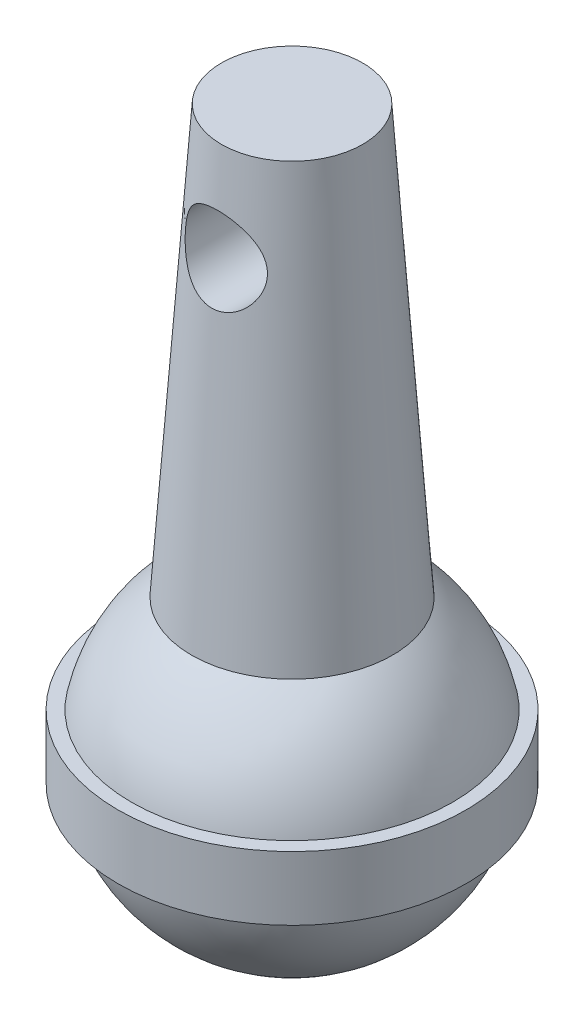
ISO-10303-21;
HEADER;
FILE_DESCRIPTION(('STEP AP214'),'2;1');
FILE_NAME('part.step','',(''),(''),'','','');
FILE_SCHEMA(('AUTOMOTIVE_DESIGN { 1 0 10303 214 1 1 1 1 }'));
ENDSEC;
DATA;
#1=APPLICATION_CONTEXT('core data for automotive mechanical design processes');
#2=APPLICATION_PROTOCOL_DEFINITION('international standard','automotive_design',2000,#1);
#3=PRODUCT_CONTEXT('',#1,'mechanical');
#4=PRODUCT('Part','Part','',(#3));
#5=PRODUCT_RELATED_PRODUCT_CATEGORY('part','',(#4));
#6=PRODUCT_DEFINITION_FORMATION('','',#4);
#7=PRODUCT_DEFINITION_CONTEXT('part definition',#1,'design');
#8=PRODUCT_DEFINITION('design','',#6,#7);
#9=PRODUCT_DEFINITION_SHAPE('','',#8);
#10=(LENGTH_UNIT() NAMED_UNIT(*) SI_UNIT(.MILLI.,.METRE.));
#11=(NAMED_UNIT(*) PLANE_ANGLE_UNIT() SI_UNIT($,.RADIAN.));
#12=(NAMED_UNIT(*) SI_UNIT($,.STERADIAN.) SOLID_ANGLE_UNIT());
#13=UNCERTAINTY_MEASURE_WITH_UNIT(LENGTH_MEASURE(1.E-05),#10,'distance_accuracy_value','');
#14=(GEOMETRIC_REPRESENTATION_CONTEXT(3) GLOBAL_UNCERTAINTY_ASSIGNED_CONTEXT((#13)) GLOBAL_UNIT_ASSIGNED_CONTEXT((#10,
#11,#12)) REPRESENTATION_CONTEXT('',''));
#15=CARTESIAN_POINT('',(0.,0.,0.));
#16=DIRECTION('',(0.,0.,1.));
#17=DIRECTION('',(1.,0.,0.));
#18=AXIS2_PLACEMENT_3D('',#15,#16,#17);
#19=CARTESIAN_POINT('',(0.,0.,0.));
#20=DIRECTION('',(0.,-1.,0.));
#21=DIRECTION('',(0.,0.,1.));
#22=AXIS2_PLACEMENT_3D('',#19,#20,#21);
#23=CONICAL_SURFACE('',#22,13.380418927628,0.0698131700797732);
#24=CARTESIAN_POINT('',(-3.28226811796898,52.490715632227,-9.13833017793002));
#25=CARTESIAN_POINT('',(-3.0836116659902,52.3178615065186,-9.22251630239014));
#26=CARTESIAN_POINT('',(-2.87026526551805,52.1598175695178,-9.30323145441792));
#27=CARTESIAN_POINT('',(-2.53110463370275,51.9484618782017,-9.41423943059822));
#28=CARTESIAN_POINT('',(-2.41476128134405,51.8822528399389,-9.44958860214446));
#29=CARTESIAN_POINT('',(-2.17622261002157,51.7589879726546,-9.51619547989016));
#30=CARTESIAN_POINT('',(-2.05403001149516,51.701927941194,-9.54745506335007));
#31=CARTESIAN_POINT('',(-1.8037308649834,51.597242719071,-9.60534826710168));
#32=CARTESIAN_POINT('',(-1.67559399676686,51.5496744619092,-9.63195386099858));
#33=CARTESIAN_POINT('',(-1.41496961452313,51.4649833902826,-9.67965933986697));
#34=CARTESIAN_POINT('',(-1.282484083358,51.4278558870422,-9.70076169594426));
#35=CARTESIAN_POINT('',(-1.01417880359896,51.3645448443119,-9.73692024518599));
#36=CARTESIAN_POINT('',(-0.878360750058606,51.3383558584094,-9.751979447159));
#37=CARTESIAN_POINT('',(-0.604473240528125,51.2972901451206,-9.77565620358024));
#38=CARTESIAN_POINT('',(-0.466404000533086,51.2824123389064,-9.78427437235445));
#39=CARTESIAN_POINT('',(-0.201207198891971,51.2649857458988,-9.79437536258491));
#40=CARTESIAN_POINT('',(-0.0741621244109475,51.2614849401913,-9.79640910199407));
#41=CARTESIAN_POINT('',(0.17983655242458,51.264168525855,-9.79485166434283));
#42=CARTESIAN_POINT('',(0.306790110271282,51.2703561405665,-9.79125861524819));
#43=CARTESIAN_POINT('',(0.559523677897544,51.2923346061479,-9.77853168473025));
#44=CARTESIAN_POINT('',(0.685304172872325,51.308121289965,-9.76940020759876));
#45=CARTESIAN_POINT('',(0.934861950215967,51.3490935000803,-9.74580772355307));
#46=CARTESIAN_POINT('',(1.05863844819504,51.3742826180462,-9.73134468004199));
#47=CARTESIAN_POINT('',(1.29895062313392,51.4326956939107,-9.69801531875508));
#48=CARTESIAN_POINT('',(1.41558749112691,51.4656035090068,-9.67932308070447));
#49=CARTESIAN_POINT('',(1.64549472233103,51.5395243764352,-9.63765986266255));
#50=CARTESIAN_POINT('',(1.75876391463656,51.58054021079,-9.61468741420195));
#51=CARTESIAN_POINT('',(2.09254080578064,51.715159342148,-9.53999786537619));
#52=CARTESIAN_POINT('',(2.30719303866061,51.8203774849062,-9.48248331334596));
#53=CARTESIAN_POINT('',(2.73430550458018,52.0685310963517,-9.35062977140302));
#54=CARTESIAN_POINT('',(2.94500803581308,52.2139227954519,-9.27527253585522));
#55=CARTESIAN_POINT('',(3.34020038902022,52.5332448672888,-9.11663104504295));
#56=CARTESIAN_POINT('',(3.52467304603729,52.7071937690589,-9.0333416579184));
#57=CARTESIAN_POINT('',(3.88658247844054,53.104161639422,-8.85387878425957));
#58=CARTESIAN_POINT('',(4.06016073923197,53.3306059342873,-8.75741079718531));
#59=CARTESIAN_POINT('',(4.29043800110099,53.6910627673487,-8.61739968198595));
#60=CARTESIAN_POINT('',(4.36222425332916,53.8147799234759,-8.57147870271249));
#61=CARTESIAN_POINT('',(4.49530579320068,54.0687463140186,-8.48234491312533));
#62=CARTESIAN_POINT('',(4.55659963488278,54.1989964455518,-8.43913247659573));
#63=CARTESIAN_POINT('',(4.66961290040087,54.4690248780491,-8.35552093654836));
#64=CARTESIAN_POINT('',(4.721024074695,54.6089664445782,-8.3152313178703));
#65=CARTESIAN_POINT('',(4.81143478436755,54.8941709889093,-8.24016070300766));
#66=CARTESIAN_POINT('',(4.85044105776799,55.0394310298719,-8.20537672147847));
#67=CARTESIAN_POINT('',(4.91534982998785,55.3340766545593,-8.14260268086239));
#68=CARTESIAN_POINT('',(4.94127104302567,55.4834560222851,-8.11460294895558));
#69=CARTESIAN_POINT('',(4.97948137918871,55.7851871709944,-8.06642811619518));
#70=CARTESIAN_POINT('',(4.99177365211626,55.9375382568943,-8.04625120809974));
#71=CARTESIAN_POINT('',(5.00156098786017,56.2218619353051,-8.01674281361485));
#72=CARTESIAN_POINT('',(5.00090945899459,56.3536561332153,-8.0062780947158));
#73=CARTESIAN_POINT('',(4.98915351314585,56.6171314735614,-7.99189844714535));
#74=CARTESIAN_POINT('',(4.97805017215937,56.7488126262384,-7.98798284436856));
#75=CARTESIAN_POINT('',(4.94544309414969,57.0109003839035,-7.98666294078478));
#76=CARTESIAN_POINT('',(4.92394001177623,57.1413070685905,-7.98925823016893));
#77=CARTESIAN_POINT('',(4.87074853914356,57.3997434315415,-8.00064808305205));
#78=CARTESIAN_POINT('',(4.8390602718257,57.5277731384773,-8.00944257172446));
#79=CARTESIAN_POINT('',(4.76913182426426,57.7691054797969,-8.03164097283019));
#80=CARTESIAN_POINT('',(4.73173490929406,57.8826985950608,-8.04456035937836));
#81=CARTESIAN_POINT('',(4.64911311663058,58.1064534183184,-8.074540325402));
#82=CARTESIAN_POINT('',(4.60388567020449,58.2166139862603,-8.09160226454447));
#83=CARTESIAN_POINT('',(4.45698709029507,58.5410435750738,-8.14808420635722));
#84=CARTESIAN_POINT('',(4.34405606806278,58.74940969526,-8.19281543067468));
#85=CARTESIAN_POINT('',(4.07857118250833,59.1664112935199,-8.29591087039771));
#86=CARTESIAN_POINT('',(3.92318781740078,59.3729984643728,-8.35519011693446));
#87=CARTESIAN_POINT('',(3.58298422970358,59.7594698715414,-8.47730092897218));
#88=CARTESIAN_POINT('',(3.39814480195224,59.9393365374004,-8.54013479470242));
#89=CARTESIAN_POINT('',(3.09036475591219,60.1957654554165,-8.63553126854364));
#90=CARTESIAN_POINT('',(2.97629774470752,60.2827817758397,-8.66916791653873));
#91=CARTESIAN_POINT('',(2.74073746790476,60.4469161988283,-8.73446475119368));
#92=CARTESIAN_POINT('',(2.61924688441686,60.5240378454518,-8.76612564342786));
#93=CARTESIAN_POINT('',(2.36947622116706,60.667812225044,-8.82650378553234));
#94=CARTESIAN_POINT('',(2.24119417758783,60.7344619075915,-8.85522017684383));
#95=CARTESIAN_POINT('',(1.9787267272207,60.8566283115295,-8.90878831626649));
#96=CARTESIAN_POINT('',(1.84454434347719,60.9121506548152,-8.93364201450405));
#97=CARTESIAN_POINT('',(1.57500750677987,61.0101079451748,-8.97806669894272));
#98=CARTESIAN_POINT('',(1.4397923869818,61.0528673170182,-8.99776670342703));
#99=CARTESIAN_POINT('',(1.16567620978165,61.1268398065863,-9.03215081455274));
#100=CARTESIAN_POINT('',(1.02677692053303,61.1580583593888,-9.0468372820383));
#101=CARTESIAN_POINT('',(0.746412233668174,61.2085711819127,-9.07072694186795));
#102=CARTESIAN_POINT('',(0.604947827023257,61.2278699596131,-9.07993220711852));
#103=CARTESIAN_POINT('',(0.320634474372924,61.2542978693233,-9.09256199003551));
#104=CARTESIAN_POINT('',(0.177785646025825,61.261428026547,-9.09598699469228));
#105=CARTESIAN_POINT('',(-0.0948582182750152,61.2633318005765,-9.09690071856711));
#106=CARTESIAN_POINT('',(-0.224645480031985,61.2591815776979,-9.09490644664148));
#107=CARTESIAN_POINT('',(-0.483386259246847,61.2408165785706,-9.08611569810854));
#108=CARTESIAN_POINT('',(-0.612339492727184,61.2265985394322,-9.07931766464633));
#109=CARTESIAN_POINT('',(-0.868378880898855,61.1882626359999,-9.06110746991148));
#110=CARTESIAN_POINT('',(-0.995465749817994,61.1641486666804,-9.04969712404184));
#111=CARTESIAN_POINT('',(-1.24699825407984,61.1062712161328,-9.02256546471949));
#112=CARTESIAN_POINT('',(-1.37144286122479,61.0725040498427,-9.00684250504008));
#113=CARTESIAN_POINT('',(-1.61563085281028,60.9960386597782,-8.97167420730974));
#114=CARTESIAN_POINT('',(-1.73540871344492,60.9534327266487,-8.95226749866079));
#115=CARTESIAN_POINT('',(-1.97089111119422,60.8594684412379,-8.91012088005233));
#116=CARTESIAN_POINT('',(-2.08659417493128,60.8081069615197,-8.8873797794723));
#117=CARTESIAN_POINT('',(-2.42662604676917,60.6414862609822,-8.81497112545572));
#118=CARTESIAN_POINT('',(-2.64404212060143,60.513638760822,-8.7610933555307));
#119=CARTESIAN_POINT('',(-3.0732093253947,60.2159363567029,-8.64248692341114));
#120=CARTESIAN_POINT('',(-3.28298834601321,60.0434735208514,-8.57722861261556));
#121=CARTESIAN_POINT('',(-3.67222659723024,59.6666744612912,-8.44666627002487));
#122=CARTESIAN_POINT('',(-3.85166070782883,59.4623120971301,-8.38136224485249));
#123=CARTESIAN_POINT('',(-4.10013281028456,59.1278475527308,-8.28747167387417));
#124=CARTESIAN_POINT('',(-4.18160655055515,59.007607788333,-8.25597448067629));
#125=CARTESIAN_POINT('',(-4.33411318862647,58.7598643780862,-8.19654315908025));
#126=CARTESIAN_POINT('',(-4.40515056630201,58.6323638817583,-8.16860750255474));
#127=CARTESIAN_POINT('',(-4.53607815172481,58.3709483839106,-8.1175816994482));
#128=CARTESIAN_POINT('',(-4.59597644922507,58.2370381270521,-8.09448803480652));
#129=CARTESIAN_POINT('',(-4.70401311468959,57.963678564866,-8.05432954338107));
#130=CARTESIAN_POINT('',(-4.75215322346131,57.8242300830346,-8.03726382398897));
#131=CARTESIAN_POINT('',(-4.83257779008316,57.5527206397823,-8.01132760384559));
#132=CARTESIAN_POINT('',(-4.86584521476075,57.421004346617,-8.00189542998484));
#133=CARTESIAN_POINT('',(-4.92158194591445,57.1550099523179,-7.98959020093993));
#134=CARTESIAN_POINT('',(-4.94405261461227,57.0207321765891,-7.98671631812756));
#135=CARTESIAN_POINT('',(-4.97795061760664,56.7508988660625,-7.98787393270823));
#136=CARTESIAN_POINT('',(-4.98938449648867,56.615344136689,-7.99190133384698));
#137=CARTESIAN_POINT('',(-5.00117612317312,56.3441453713132,-8.00689587398961));
#138=CARTESIAN_POINT('',(-5.00153457568264,56.2085013415422,-8.01786257141471));
#139=CARTESIAN_POINT('',(-4.99189253306535,55.9537553294487,-8.04483857983509));
#140=CARTESIAN_POINT('',(-4.98306842513051,55.8345305593621,-8.06013041748964));
#141=CARTESIAN_POINT('',(-4.95703688709815,55.5977212761142,-8.09558813134582));
#142=CARTESIAN_POINT('',(-4.93982687545509,55.4801372795276,-8.11575550748613));
#143=CARTESIAN_POINT('',(-4.87598580112637,55.1308700755871,-8.1828840673629));
#144=CARTESIAN_POINT('',(-4.81713980149228,54.9025770774756,-8.2364822561896));
#145=CARTESIAN_POINT('',(-4.66473268859569,54.4453590423553,-8.36043517407914));
#146=CARTESIAN_POINT('',(-4.56917020502624,54.2173505148922,-8.4316502776063));
#147=CARTESIAN_POINT('',(-4.34713420293015,53.7801054928579,-8.58252397626656));
#148=CARTESIAN_POINT('',(-4.22066961811782,53.5708635967614,-8.66218012735301));
#149=CARTESIAN_POINT('',(-3.96522196522042,53.2102622138412,-8.80921090254106));
#150=CARTESIAN_POINT('',(-3.84098014685687,53.0553350022127,-8.87614978589065));
#151=CARTESIAN_POINT('',(-3.57472506009406,52.7610108592365,-9.00883282732082));
#152=CARTESIAN_POINT('',(-3.43270885548855,52.6216165010176,-9.07457678594834));
#153=CARTESIAN_POINT('',(-3.28226811796898,52.490715632227,-9.13833017793002));
#154=B_SPLINE_CURVE_WITH_KNOTS('',3,(#24,#25,#26,#27,#28,#29,#30,#31,#32,#33,#34,#35,#36,#37,
#38,#39,#40,#41,#42,#43,#44,#45,#46,#47,#48,#49,#50,#51,#52,#53,#54,#55,#56,#57,#58,#59,#60,#61,
#62,#63,#64,#65,#66,#67,#68,#69,#70,#71,#72,#73,#74,#75,#76,#77,#78,#79,#80,#81,#82,#83,#84,#85,
#86,#87,#88,#89,#90,#91,#92,#93,#94,#95,#96,#97,#98,#99,#100,#101,#102,#103,#104,#105,#106,#107,
#108,#109,#110,#111,#112,#113,#114,#115,#116,#117,#118,#119,#120,#121,#122,#123,#124,#125,#126,
#127,#128,#129,#130,#131,#132,#133,#134,#135,#136,#137,#138,#139,#140,#141,#142,#143,#144,#145,
#146,#147,#148,#149,#150,#151,#152,#153),.UNSPECIFIED.,.T.,.F.,(4,2,2,2,2,2,2,2,2,2,2,2,2,2,2,2,
2,2,2,2,2,2,2,2,2,2,2,2,2,2,2,2,2,2,2,2,2,2,2,2,2,2,2,2,2,2,2,2,2,2,2,2,2,2,2,2,2,2,2,2,2,2,2,2,
4),(0.,0.828623111056269,1.24359176501727,1.65836926080661,2.07556445647543,2.49257199616484,
2.9093716548046,3.32613155529747,3.70697502892076,4.08794523620362,4.46875017843104,
4.84970073474261,5.21716007473883,5.5847457168674,6.31937636053983,7.11683915539238,
7.91482143535248,8.81399334182593,9.26424984846228,9.71456835517403,10.1772218816425,
10.6396236757322,11.1013622569348,11.5629941028666,11.9590715370439,12.3551082001673,
12.7511199365599,13.1471268930311,13.5075928685287,13.8681773163485,14.5888826652384,
15.3815118656917,16.1746599856621,16.6162860598278,17.0577535088385,17.4993493172417,
17.9407214514291,18.3696684407389,18.7984131619817,19.2269956354032,19.6555419986963,
20.0446734167819,20.4339310066532,20.8230355339586,21.2122887988719,21.5976656056697,
21.9831803566631,22.7536924279482,23.5882333698766,24.4234618118347,24.8688339098924,
25.3140142670303,25.7588700385771,26.2036599089626,26.6116121603441,27.0195129270538,
27.4271716682825,27.8348044709524,28.1959621519461,28.5572310832741,29.2794865152292,
30.0485155099586,30.8173224429638,31.4447274636406,32.072236264444),.UNSPECIFIED.);
#155=CARTESIAN_POINT('',(-3.28226811796898,52.490715632227,-9.13833017793002));
#156=VERTEX_POINT('',#155);
#157=EDGE_CURVE('E79',#156,#156,#154,.T.);
#158=ORIENTED_EDGE('',*,*,#157,.T.);
#159=EDGE_LOOP('',(#158));
#160=FACE_BOUND('',#159,.T.);
#161=CARTESIAN_POINT('',(-3.7626139591381,52.9697165177601,8.91491747290497));
#162=CARTESIAN_POINT('',(-3.94684427085551,53.1802431809813,8.82117686905229));
#163=CARTESIAN_POINT('',(-4.11343273006128,53.4062696081218,8.72653040253059));
#164=CARTESIAN_POINT('',(-4.33393441182794,53.7651823569869,8.58976835716758));
#165=CARTESIAN_POINT('',(-4.40260585612602,53.8882993312613,8.54499599501517));
#166=CARTESIAN_POINT('',(-4.52967616705959,54.1407599715523,8.4582993413821));
#167=CARTESIAN_POINT('',(-4.58807446788285,54.2701039800349,8.41637520685082));
#168=CARTESIAN_POINT('',(-4.69433834185058,54.5352043871628,8.33630724042309));
#169=CARTESIAN_POINT('',(-4.74213519791346,54.6709960684797,8.29818890486979));
#170=CARTESIAN_POINT('',(-4.82610251230373,54.9474124030857,8.22723689643725));
#171=CARTESIAN_POINT('',(-4.86227884607332,55.0880345740959,8.19440055713849));
#172=CARTESIAN_POINT('',(-4.92238261080205,55.3729868248688,8.1351577119651));
#173=CARTESIAN_POINT('',(-4.94632828125381,55.5173110442125,8.1087416625833));
#174=CARTESIAN_POINT('',(-4.98151388053607,55.8086385166566,8.06323856047836));
#175=CARTESIAN_POINT('',(-4.9927560981106,55.9556412823201,8.0441501879584));
#176=CARTESIAN_POINT('',(-5.00162783388129,56.2339312778752,8.01570590058449));
#177=CARTESIAN_POINT('',(-5.00067113797792,56.3650865873101,8.00548464937062));
#178=CARTESIAN_POINT('',(-4.98840693217813,56.6272550275613,7.99152998656925));
#179=CARTESIAN_POINT('',(-4.9771002968486,56.7582681694543,7.98779602688475));
#180=CARTESIAN_POINT('',(-4.94419067596354,57.0190191775664,7.98677099418636));
#181=CARTESIAN_POINT('',(-4.92258741432128,57.1487570094951,7.98948009394005));
#182=CARTESIAN_POINT('',(-4.869299126705,57.4058596972873,8.00102990312821));
#183=CARTESIAN_POINT('',(-4.83761424218203,57.533224586418,8.00987052653589));
#184=CARTESIAN_POINT('',(-4.76762449147556,57.773868610283,8.03214908293242));
#185=CARTESIAN_POINT('',(-4.73011468658646,57.887422646451,8.04513062412517));
#186=CARTESIAN_POINT('',(-4.64727119084248,58.1110906677093,8.07522713220806));
#187=CARTESIAN_POINT('',(-4.60193491899665,58.2212035037775,8.09234346340393));
#188=CARTESIAN_POINT('',(-4.45471655748728,58.5454790056204,8.14897534218449));
#189=CARTESIAN_POINT('',(-4.34158118169728,58.7537276402687,8.19378893956454));
#190=CARTESIAN_POINT('',(-4.07562589581978,59.1705531072743,8.29704082856073));
#191=CARTESIAN_POINT('',(-3.91996439938458,59.3770693706405,8.35639467891566));
#192=CARTESIAN_POINT('',(-3.57919941488789,59.763352022577,8.47861101359552));
#193=CARTESIAN_POINT('',(-3.39407676796293,59.9431008557713,8.54147576370464));
#194=CARTESIAN_POINT('',(-3.08588920534017,60.1992788258511,8.63687232521069));
#195=CARTESIAN_POINT('',(-2.97169989797799,60.2861827233543,8.67049526508485));
#196=CARTESIAN_POINT('',(-2.73590110062661,60.4500810385352,8.73575050111137));
#197=CARTESIAN_POINT('',(-2.61429429556813,60.5270790108746,8.76738350924072));
#198=CARTESIAN_POINT('',(-2.36429917749388,60.670593962672,8.82769205578869));
#199=CARTESIAN_POINT('',(-2.23590892326136,60.7371079199949,8.85636674061748));
#200=CARTESIAN_POINT('',(-1.97323497988888,60.8589908480314,8.90983849832915));
#201=CARTESIAN_POINT('',(-1.83895431254208,60.9143654536621,8.93463753031381));
#202=CARTESIAN_POINT('',(-1.56930090121957,61.0119962459484,8.97893210104059));
#203=CARTESIAN_POINT('',(-1.43406945555214,61.0545825844461,8.99855913629402));
#204=CARTESIAN_POINT('',(-1.15993788561461,61.1282102665193,9.03279291059245));
#205=CARTESIAN_POINT('',(-1.02103952177944,61.1592570458786,9.04740201312029));
#206=CARTESIAN_POINT('',(-0.740694295854769,61.2094295679733,9.0711351803551));
#207=CARTESIAN_POINT('',(-0.599248414534917,61.2285598016225,9.08026131134899));
#208=CARTESIAN_POINT('',(-0.314989787509445,61.2546560265016,9.0927337507318));
#209=CARTESIAN_POINT('',(-0.172177157492242,61.2616230382891,9.09608054403689));
#210=CARTESIAN_POINT('',(0.100392844252656,61.2632229695956,9.09684851204996));
#211=CARTESIAN_POINT('',(0.230143926703684,61.258930490985,9.09478595630837));
#212=CARTESIAN_POINT('',(0.4887993019819,61.2402871548693,9.08586259930203));
#213=CARTESIAN_POINT('',(0.617703306633185,61.2259330367903,9.07900024261581));
#214=CARTESIAN_POINT('',(0.873632698584984,61.1873326143435,9.06066704239042));
#215=CARTESIAN_POINT('',(1.00065880264266,61.1630901907376,9.04919800681433));
#216=CARTESIAN_POINT('',(1.25205965701026,61.1049643915168,9.02195590019701));
#217=CARTESIAN_POINT('',(1.37643337514237,61.071077333709,9.00618118539925));
#218=CARTESIAN_POINT('',(1.6205199338934,60.9943674655403,8.97091088700487));
#219=CARTESIAN_POINT('',(1.74026598381151,60.9516332547777,8.95145234883303));
#220=CARTESIAN_POINT('',(1.97567474485291,60.8574149066001,8.9092081048502));
#221=CARTESIAN_POINT('',(2.09133597866546,60.8059276419199,8.88642121030508));
#222=CARTESIAN_POINT('',(2.431229085163,60.6389338423365,8.81388586518707));
#223=CARTESIAN_POINT('',(2.64853439589807,60.5108432725291,8.75993789104484));
#224=CARTESIAN_POINT('',(3.07747474370747,60.2126222617984,8.64121274396914));
#225=CARTESIAN_POINT('',(3.28713063267388,60.0398792219017,8.57590788375691));
#226=CARTESIAN_POINT('',(3.67607675880058,59.6625233571244,8.44530462722069));
#227=CARTESIAN_POINT('',(3.85534185565408,59.4578844128354,8.38000628047669));
#228=CARTESIAN_POINT('',(4.10348860502107,59.123040034483,8.28618421080914));
#229=CARTESIAN_POINT('',(4.18482751898385,59.0026955963648,8.25472591795557));
#230=CARTESIAN_POINT('',(4.33705529128414,58.7547520673525,8.19538975386739));
#231=CARTESIAN_POINT('',(4.40794864289842,58.6271561286971,8.16751034380432));
#232=CARTESIAN_POINT('',(4.53857781342545,58.3655629861063,8.11661442528505));
#233=CARTESIAN_POINT('',(4.59832188376392,58.2315706090576,8.09359431885887));
#234=CARTESIAN_POINT('',(4.70604106438434,57.958061310942,8.05359847341263));
#235=CARTESIAN_POINT('',(4.7540179244457,57.8185452148377,8.03662183556154));
#236=CARTESIAN_POINT('',(4.83410037850899,57.5469967493846,8.01087544857291));
#237=CARTESIAN_POINT('',(4.86719544932282,57.4153096859223,8.00153965535222));
#238=CARTESIAN_POINT('',(4.92259518767157,57.1493930405524,7.98942664175742));
#239=CARTESIAN_POINT('',(4.94490121041556,57.0151637801716,7.98664859749627));
#240=CARTESIAN_POINT('',(4.97848130744573,56.7454390695825,7.98799273245158));
#241=CARTESIAN_POINT('',(4.98976134913561,56.6099443443936,7.99211117592126));
#242=CARTESIAN_POINT('',(5.00125721084864,56.3388819569224,8.00727915216413));
#243=CARTESIAN_POINT('',(5.00147371784904,56.2033142996917,8.01832825454304));
#244=CARTESIAN_POINT('',(4.99157490869327,55.948666670432,8.04545460728162));
#245=CARTESIAN_POINT('',(4.98263027681354,55.829462890808,8.06081823075864));
#246=CARTESIAN_POINT('',(4.95636129902529,55.5927058861001,8.09641331446439));
#247=CARTESIAN_POINT('',(4.93903439288456,55.475153176605,8.11664626100088));
#248=CARTESIAN_POINT('',(4.87485918167835,55.12604203361,8.18395004339893));
#249=CARTESIAN_POINT('',(4.81581029725556,54.8978865594676,8.23764202015873));
#250=CARTESIAN_POINT('',(4.66298941677256,54.4408937135688,8.36176779728639));
#251=CARTESIAN_POINT('',(4.56720844844017,54.2129775314012,8.4330634913961));
#252=CARTESIAN_POINT('',(4.34467994021766,53.7757924700271,8.58410989131574));
#253=CARTESIAN_POINT('',(4.21791512228829,53.5665340844465,8.66386530056236));
#254=CARTESIAN_POINT('',(3.91386695440877,53.1382879537221,8.83865216379517));
#255=CARTESIAN_POINT('',(3.73178718368407,52.9228773655135,8.93412533370037));
#256=CARTESIAN_POINT('',(3.33252689758337,52.5244026417537,9.12025816913192));
#257=CARTESIAN_POINT('',(3.11532577431213,52.3413576299323,9.21091496684512));
#258=CARTESIAN_POINT('',(2.76134458186686,52.0915672552356,9.33899603089766));
#259=CARTESIAN_POINT('',(2.63577526282456,52.0110650680128,9.38114523939692));
#260=CARTESIAN_POINT('',(2.3768653724201,51.8610863737474,9.46087241968224));
#261=CARTESIAN_POINT('',(2.24352848345421,51.791604699407,9.4984525318849));
#262=CARTESIAN_POINT('',(1.97001171021675,51.6645279945789,9.56799739382522));
#263=CARTESIAN_POINT('',(1.82983640963634,51.6069251336581,9.59996584065309));
#264=CARTESIAN_POINT('',(1.54364165795051,51.5043691503711,9.65737983616917));
#265=CARTESIAN_POINT('',(1.39762320184214,51.4594138847013,9.68282648999708));
#266=CARTESIAN_POINT('',(1.11766691916734,51.3871685182131,9.72396188388356));
#267=CARTESIAN_POINT('',(0.984206310085284,51.3584643565025,9.7404240303174));
#268=CARTESIAN_POINT('',(0.714785009815992,51.3120161609449,9.76714829100137));
#269=CARTESIAN_POINT('',(0.578824642511839,51.2942707173856,9.77741120270762));
#270=CARTESIAN_POINT('',(0.305652256585129,51.2700161474486,9.79145488350004));
#271=CARTESIAN_POINT('',(0.168441018479181,51.2635004398159,9.79523944925145));
#272=CARTESIAN_POINT('',(-0.106071844300603,51.2617891539897,9.7962324856995));
#273=CARTESIAN_POINT('',(-0.243373462224196,51.2665928092256,9.79344140171272));
#274=CARTESIAN_POINT('',(-0.502563914793393,51.2863520532843,9.78199399228595));
#275=CARTESIAN_POINT('',(-0.624567840557115,51.3001975280922,9.77397920252545));
#276=CARTESIAN_POINT('',(-0.866839769284059,51.3367378130216,9.75291309424142));
#277=CARTESIAN_POINT('',(-0.987107220600285,51.3594353738236,9.73986021020301));
#278=CARTESIAN_POINT('',(-1.22506402522706,51.4134139102445,9.70899473864766));
#279=CARTESIAN_POINT('',(-1.34275363666175,51.4446940221938,9.69118263006031));
#280=CARTESIAN_POINT('',(-1.5748776320061,51.5154950214136,9.6511649888786));
#281=CARTESIAN_POINT('',(-1.68931078096487,51.5550189888997,9.62895781428067));
#282=CARTESIAN_POINT('',(-2.03192887459472,51.6873949727632,9.55525354270962));
#283=CARTESIAN_POINT('',(-2.25403680202589,51.7928174248916,9.49739705282313));
#284=CARTESIAN_POINT('',(-2.67755069538197,52.0328843216953,9.36935436014346));
#285=CARTESIAN_POINT('',(-2.87896813438467,52.1675124412439,9.29917504961199));
#286=CARTESIAN_POINT('',(-3.19508509867088,52.4132559517937,9.17591306654062));
#287=CARTESIAN_POINT('',(-3.31627564959412,52.5172012520549,9.1249511779728));
#288=CARTESIAN_POINT('',(-3.54774456997598,52.7356709083152,9.02106274670658));
#289=CARTESIAN_POINT('',(-3.65802232389224,52.8501958603618,8.96813609341582));
#290=CARTESIAN_POINT('',(-3.7626139591381,52.9697165177601,8.91491747290497));
#291=B_SPLINE_CURVE_WITH_KNOTS('',3,(#161,#162,#163,#164,#165,#166,#167,#168,#169,#170,#171,
#172,#173,#174,#175,#176,#177,#178,#179,#180,#181,#182,#183,#184,#185,#186,#187,#188,#189,#190,
#191,#192,#193,#194,#195,#196,#197,#198,#199,#200,#201,#202,#203,#204,#205,#206,#207,#208,#209,
#210,#211,#212,#213,#214,#215,#216,#217,#218,#219,#220,#221,#222,#223,#224,#225,#226,#227,#228,
#229,#230,#231,#232,#233,#234,#235,#236,#237,#238,#239,#240,#241,#242,#243,#244,#245,#246,#247,
#248,#249,#250,#251,#252,#253,#254,#255,#256,#257,#258,#259,#260,#261,#262,#263,#264,#265,#266,
#267,#268,#269,#270,#271,#272,#273,#274,#275,#276,#277,#278,#279,#280,#281,#282,#283,#284,#285,
#286,#287,#288,#289,#290),.UNSPECIFIED.,.T.,.F.,(4,2,2,2,2,2,2,2,2,2,2,2,2,2,2,2,2,2,2,2,2,2,2,
2,2,2,2,2,2,2,2,2,2,2,2,2,2,2,2,2,2,2,2,2,2,2,2,2,2,2,2,2,2,2,2,2,2,2,2,2,2,2,2,2,4),(0.,
0.884469284498907,1.32781921834886,1.77119356287047,2.21736286031691,2.66330621410636,
3.10858257999262,3.5537787089383,3.94789821611989,4.34198442339103,4.73608119801542,
5.13017244347593,5.49065312016278,5.85125290307432,6.57198949925169,7.36498966450143,
8.15850764850949,8.60020901970654,9.04175144517147,9.48342091834269,9.924866405034,
10.3536750473273,10.7822814397746,11.2107262081453,11.6391350260479,12.0281754201458,
12.4173419449577,12.8063558842943,13.1955185436604,13.5809576917774,13.9665348389742,
14.737173237112,15.5719866097454,16.4074872341061,16.852866761016,17.2980541400233,
17.7429107240422,18.1877011179068,18.5954231634276,19.0030939817973,19.4105440410775,
19.8179688001924,20.1791186976418,20.5403789722878,21.2624693708004,22.0315344030952,
22.8010292843143,23.6905989470811,24.580692482843,25.045146231799,25.5093815597768,
25.9733098818038,26.4371595375656,26.8490896980244,27.2609668573885,27.6726025514526,
28.0842103694977,28.4529239963346,28.8217522879535,29.1905434776665,29.559472709327,
30.3138852805741,31.067877238532,31.5699817685779,32.0721146039844),.UNSPECIFIED.);
#292=CARTESIAN_POINT('',(-3.7626139591381,52.9697165177601,8.91491747290497));
#293=VERTEX_POINT('',#292);
#294=EDGE_CURVE('E72',#293,#293,#291,.T.);
#295=ORIENTED_EDGE('',*,*,#294,.T.);
#296=EDGE_LOOP('',(#295));
#297=FACE_BOUND('',#296,.T.);
#298=CARTESIAN_POINT('',(0.,15.7889613164655,0.));
#299=DIRECTION('',(0.,-1.,0.));
#300=DIRECTION('',(0.,0.,-1.));
#301=AXIS2_PLACEMENT_3D('',#298,#299,#300);
#302=CIRCLE('',#301,12.2763471988681);
#303=CARTESIAN_POINT('',(0.,15.7889613164655,-12.2763471988681));
#304=VERTEX_POINT('',#303);
#305=EDGE_CURVE('E78',#304,#304,#302,.T.);
#306=ORIENTED_EDGE('',*,*,#305,.F.);
#307=EDGE_LOOP('',(#306));
#308=FACE_BOUND('',#307,.T.);
#309=CARTESIAN_POINT('',(0.,68.,0.));
#310=DIRECTION('',(0.,1.,0.));
#311=DIRECTION('',(0.,0.,1.));
#312=AXIS2_PLACEMENT_3D('',#309,#310,#311);
#313=CIRCLE('',#312,8.62539571546927);
#314=CARTESIAN_POINT('',(0.,68.,8.62539571546927));
#315=VERTEX_POINT('',#314);
#316=EDGE_CURVE('E75',#315,#315,#313,.T.);
#317=ORIENTED_EDGE('',*,*,#316,.F.);
#318=EDGE_LOOP('',(#317));
#319=FACE_BOUND('',#318,.T.);
#320=ADVANCED_FACE('F35',(#160,#297,#308,#319),#23,.T.);
#321=CARTESIAN_POINT('',(0.,68.,0.));
#322=DIRECTION('',(0.,1.,0.));
#323=DIRECTION('',(0.,0.,1.));
#324=AXIS2_PLACEMENT_3D('',#321,#322,#323);
#325=PLANE('',#324);
#326=ORIENTED_EDGE('',*,*,#316,.T.);
#327=EDGE_LOOP('',(#326));
#328=FACE_BOUND('',#327,.T.);
#329=ADVANCED_FACE('F100',(#328),#325,.T.);
#330=CARTESIAN_POINT('',(0.,0.,0.));
#331=DIRECTION('',(0.,1.,0.));
#332=DIRECTION('',(1.,0.,0.));
#333=AXIS2_PLACEMENT_3D('',#330,#331,#332);
#334=SPHERICAL_SURFACE('',#333,20.);
#335=CARTESIAN_POINT('',(0.,3.90368414490159,0.));
#336=DIRECTION('',(0.,1.,0.));
#337=DIRECTION('',(0.,0.,1.));
#338=AXIS2_PLACEMENT_3D('',#335,#336,#337);
#339=CIRCLE('',#338,19.6153320159727);
#340=CARTESIAN_POINT('',(0.,3.90368414490159,19.6153320159727));
#341=VERTEX_POINT('',#340);
#342=EDGE_CURVE('E43',#341,#341,#339,.F.);
#343=ORIENTED_EDGE('',*,*,#342,.F.);
#344=EDGE_LOOP('',(#343));
#345=FACE_BOUND('',#344,.T.);
#346=ORIENTED_EDGE('',*,*,#305,.T.);
#347=EDGE_LOOP('',(#346));
#348=FACE_BOUND('',#347,.T.);
#349=ADVANCED_FACE('F37',(#345,#348),#334,.T.);
#350=CARTESIAN_POINT('',(0.,56.2625475481223,-68.));
#351=DIRECTION('',(0.,0.,1.));
#352=DIRECTION('',(1.,0.,0.));
#353=AXIS2_PLACEMENT_3D('',#350,#351,#352);
#354=CYLINDRICAL_SURFACE('',#353,5.);
#355=ORIENTED_EDGE('',*,*,#294,.F.);
#356=EDGE_LOOP('',(#355));
#357=FACE_BOUND('',#356,.T.);
#358=ORIENTED_EDGE('',*,*,#157,.F.);
#359=EDGE_LOOP('',(#358));
#360=FACE_BOUND('',#359,.T.);
#361=ADVANCED_FACE('F93',(#357,#360),#354,.F.);
#362=CARTESIAN_POINT('',(0.,-3.90368414490187,21.2483539824773));
#363=DIRECTION('',(0.,-1.,0.));
#364=DIRECTION('',(0.,0.,-1.));
#365=AXIS2_PLACEMENT_3D('',#362,#363,#364);
#366=PLANE('',#365);
#367=CARTESIAN_POINT('',(0.,-3.90368414490187,0.));
#368=DIRECTION('',(0.,1.,0.));
#369=DIRECTION('',(0.,0.,1.));
#370=AXIS2_PLACEMENT_3D('',#367,#368,#369);
#371=CIRCLE('',#370,21.2483539824773);
#372=CARTESIAN_POINT('',(0.,-3.90368414490187,21.2483539824773));
#373=VERTEX_POINT('',#372);
#374=EDGE_CURVE('E69',#373,#373,#371,.T.);
#375=ORIENTED_EDGE('',*,*,#374,.F.);
#376=EDGE_LOOP('',(#375));
#377=FACE_BOUND('',#376,.T.);
#378=CARTESIAN_POINT('',(0.,-3.90368414490187,0.));
#379=DIRECTION('',(0.,-1.,0.));
#380=DIRECTION('',(0.,0.,-1.));
#381=AXIS2_PLACEMENT_3D('',#378,#379,#380);
#382=CIRCLE('',#381,19.6153320159727);
#383=CARTESIAN_POINT('',(0.,-3.90368414490187,19.6153320159727));
#384=VERTEX_POINT('',#383);
#385=EDGE_CURVE('E11',#384,#384,#382,.F.);
#386=ORIENTED_EDGE('',*,*,#385,.T.);
#387=EDGE_LOOP('',(#386));
#388=FACE_BOUND('',#387,.T.);
#389=ADVANCED_FACE('F97',(#377,#388),#366,.T.);
#390=CARTESIAN_POINT('',(0.,0.,0.));
#391=DIRECTION('',(0.,1.,0.));
#392=DIRECTION('',(0.,0.,1.));
#393=AXIS2_PLACEMENT_3D('',#390,#391,#392);
#394=CYLINDRICAL_SURFACE('',#393,21.2483539824773);
#395=DIRECTION('',(0.,-1.,0.));
#396=VECTOR('',#395,1.);
#397=CARTESIAN_POINT('',(0.,-3.90368414490187,21.2483539824773));
#398=LINE('',#397,#396);
#399=CARTESIAN_POINT('',(0.,3.90368414490159,21.2483539824773));
#400=VERTEX_POINT('',#399);
#401=EDGE_CURVE('E63',#400,#373,#398,.T.);
#402=ORIENTED_EDGE('',*,*,#401,.F.);
#403=CARTESIAN_POINT('',(0.,3.90368414490159,0.));
#404=DIRECTION('',(0.,1.,0.));
#405=DIRECTION('',(0.,0.,1.));
#406=AXIS2_PLACEMENT_3D('',#403,#404,#405);
#407=CIRCLE('',#406,21.2483539824773);
#408=EDGE_CURVE('E62',#400,#400,#407,.T.);
#409=ORIENTED_EDGE('',*,*,#408,.F.);
#410=ORIENTED_EDGE('',*,*,#401,.T.);
#411=ORIENTED_EDGE('',*,*,#374,.T.);
#412=EDGE_LOOP('',(#402,#409,#410,#411));
#413=FACE_BOUND('',#412,.T.);
#414=ADVANCED_FACE('F146',(#413),#394,.T.);
#415=CARTESIAN_POINT('',(0.,3.90368414490159,21.2483539824773));
#416=DIRECTION('',(0.,1.,0.));
#417=DIRECTION('',(0.,0.,1.));
#418=AXIS2_PLACEMENT_3D('',#415,#416,#417);
#419=PLANE('',#418);
#420=ORIENTED_EDGE('',*,*,#408,.T.);
#421=EDGE_LOOP('',(#420));
#422=FACE_BOUND('',#421,.T.);
#423=ORIENTED_EDGE('',*,*,#342,.T.);
#424=EDGE_LOOP('',(#423));
#425=FACE_BOUND('',#424,.T.);
#426=ADVANCED_FACE('F60',(#422,#425),#419,.T.);
#427=ORIENTED_EDGE('',*,*,#385,.F.);
#428=EDGE_LOOP('',(#427));
#429=FACE_BOUND('',#428,.T.);
#430=ADVANCED_FACE('F108',(#429),#334,.T.);
#431=CLOSED_SHELL('',(#320,#329,#349,#361,#389,#414,#426,#430));
#432=MANIFOLD_SOLID_BREP('B2',#431);
#433=ADVANCED_BREP_SHAPE_REPRESENTATION('',(#18,#432),#14);
#434=SHAPE_DEFINITION_REPRESENTATION(#9,#433);
ENDSEC;
END-ISO-10303-21;
